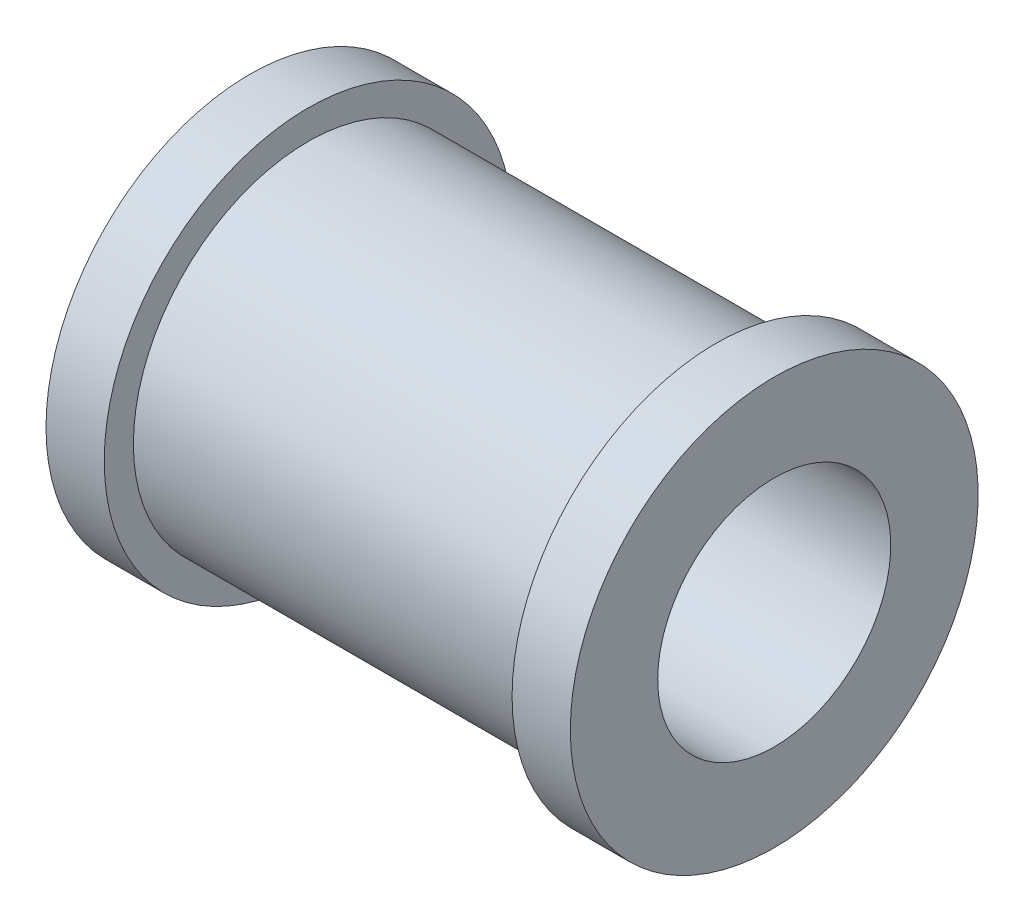
ISO-10303-21;
HEADER;
FILE_DESCRIPTION(('STEP AP214'),'2;1');
FILE_NAME('part.step','',(''),(''),'','','');
FILE_SCHEMA(('AUTOMOTIVE_DESIGN { 1 0 10303 214 1 1 1 1 }'));
ENDSEC;
DATA;
#1=APPLICATION_CONTEXT('core data for automotive mechanical design processes');
#2=APPLICATION_PROTOCOL_DEFINITION('international standard','automotive_design',2000,#1);
#3=PRODUCT_CONTEXT('',#1,'mechanical');
#4=PRODUCT('Part','Part','',(#3));
#5=PRODUCT_RELATED_PRODUCT_CATEGORY('part','',(#4));
#6=PRODUCT_DEFINITION_FORMATION('','',#4);
#7=PRODUCT_DEFINITION_CONTEXT('part definition',#1,'design');
#8=PRODUCT_DEFINITION('design','',#6,#7);
#9=PRODUCT_DEFINITION_SHAPE('','',#8);
#10=(LENGTH_UNIT() NAMED_UNIT(*) SI_UNIT(.MILLI.,.METRE.));
#11=(NAMED_UNIT(*) PLANE_ANGLE_UNIT() SI_UNIT($,.RADIAN.));
#12=(NAMED_UNIT(*) SI_UNIT($,.STERADIAN.) SOLID_ANGLE_UNIT());
#13=UNCERTAINTY_MEASURE_WITH_UNIT(LENGTH_MEASURE(1.E-05),#10,'distance_accuracy_value','');
#14=(GEOMETRIC_REPRESENTATION_CONTEXT(3) GLOBAL_UNCERTAINTY_ASSIGNED_CONTEXT((#13)) GLOBAL_UNIT_ASSIGNED_CONTEXT((#10,
#11,#12)) REPRESENTATION_CONTEXT('',''));
#15=CARTESIAN_POINT('',(0.,0.,0.));
#16=DIRECTION('',(0.,0.,1.));
#17=DIRECTION('',(1.,0.,0.));
#18=AXIS2_PLACEMENT_3D('',#15,#16,#17);
#19=CARTESIAN_POINT('',(0.,0.,0.));
#20=DIRECTION('',(-1.,0.,0.));
#21=DIRECTION('',(0.,0.,1.));
#22=AXIS2_PLACEMENT_3D('',#19,#20,#21);
#23=CYLINDRICAL_SURFACE('',#22,4.);
#24=CARTESIAN_POINT('',(18.,0.,0.));
#25=DIRECTION('',(-1.,0.,0.));
#26=DIRECTION('',(0.,0.,1.));
#27=AXIS2_PLACEMENT_3D('',#24,#25,#26);
#28=CIRCLE('',#27,4.);
#29=CARTESIAN_POINT('',(18.,0.,4.));
#30=VERTEX_POINT('',#29);
#31=EDGE_CURVE('E74',#30,#30,#28,.T.);
#32=ORIENTED_EDGE('',*,*,#31,.F.);
#33=EDGE_LOOP('',(#32));
#34=FACE_BOUND('',#33,.T.);
#35=CARTESIAN_POINT('',(0.,0.,0.));
#36=DIRECTION('',(-1.,0.,0.));
#37=DIRECTION('',(0.,0.,1.));
#38=AXIS2_PLACEMENT_3D('',#35,#36,#37);
#39=CIRCLE('',#38,4.);
#40=CARTESIAN_POINT('',(0.,0.,4.));
#41=VERTEX_POINT('',#40);
#42=EDGE_CURVE('E10',#41,#41,#39,.T.);
#43=ORIENTED_EDGE('',*,*,#42,.T.);
#44=EDGE_LOOP('',(#43));
#45=FACE_BOUND('',#44,.T.);
#46=ADVANCED_FACE('F39',(#34,#45),#23,.F.);
#47=CARTESIAN_POINT('',(0.,4.,0.));
#48=DIRECTION('',(1.,0.,0.));
#49=DIRECTION('',(0.,0.,-1.));
#50=AXIS2_PLACEMENT_3D('',#47,#48,#49);
#51=PLANE('',#50);
#52=ORIENTED_EDGE('',*,*,#42,.F.);
#53=EDGE_LOOP('',(#52));
#54=FACE_BOUND('',#53,.T.);
#55=CARTESIAN_POINT('',(0.,0.,0.));
#56=DIRECTION('',(-1.,0.,0.));
#57=DIRECTION('',(0.,0.,1.));
#58=AXIS2_PLACEMENT_3D('',#55,#56,#57);
#59=CIRCLE('',#58,7.);
#60=CARTESIAN_POINT('',(0.,0.,7.));
#61=VERTEX_POINT('',#60);
#62=EDGE_CURVE('E46',#61,#61,#59,.T.);
#63=ORIENTED_EDGE('',*,*,#62,.T.);
#64=EDGE_LOOP('',(#63));
#65=FACE_BOUND('',#64,.T.);
#66=ADVANCED_FACE('F82',(#54,#65),#51,.F.);
#67=CARTESIAN_POINT('',(0.,0.,0.));
#68=DIRECTION('',(-1.,0.,0.));
#69=DIRECTION('',(0.,0.,1.));
#70=AXIS2_PLACEMENT_3D('',#67,#68,#69);
#71=CYLINDRICAL_SURFACE('',#70,7.);
#72=ORIENTED_EDGE('',*,*,#62,.F.);
#73=EDGE_LOOP('',(#72));
#74=FACE_BOUND('',#73,.T.);
#75=CARTESIAN_POINT('',(2.,0.,0.));
#76=DIRECTION('',(-1.,0.,0.));
#77=DIRECTION('',(0.,0.,1.));
#78=AXIS2_PLACEMENT_3D('',#75,#76,#77);
#79=CIRCLE('',#78,7.);
#80=CARTESIAN_POINT('',(2.,0.,7.));
#81=VERTEX_POINT('',#80);
#82=EDGE_CURVE('E51',#81,#81,#79,.T.);
#83=ORIENTED_EDGE('',*,*,#82,.T.);
#84=EDGE_LOOP('',(#83));
#85=FACE_BOUND('',#84,.T.);
#86=ADVANCED_FACE('F86',(#74,#85),#71,.T.);
#87=CARTESIAN_POINT('',(2.,7.,0.));
#88=DIRECTION('',(-1.,0.,0.));
#89=DIRECTION('',(0.,0.,1.));
#90=AXIS2_PLACEMENT_3D('',#87,#88,#89);
#91=PLANE('',#90);
#92=ORIENTED_EDGE('',*,*,#82,.F.);
#93=EDGE_LOOP('',(#92));
#94=FACE_BOUND('',#93,.T.);
#95=CARTESIAN_POINT('',(2.,0.,0.));
#96=DIRECTION('',(-1.,0.,0.));
#97=DIRECTION('',(0.,0.,1.));
#98=AXIS2_PLACEMENT_3D('',#95,#96,#97);
#99=CIRCLE('',#98,6.);
#100=CARTESIAN_POINT('',(2.,0.,6.));
#101=VERTEX_POINT('',#100);
#102=EDGE_CURVE('E56',#101,#101,#99,.T.);
#103=ORIENTED_EDGE('',*,*,#102,.T.);
#104=EDGE_LOOP('',(#103));
#105=FACE_BOUND('',#104,.T.);
#106=ADVANCED_FACE('F91',(#94,#105),#91,.F.);
#107=CARTESIAN_POINT('',(0.,0.,0.));
#108=DIRECTION('',(-1.,0.,0.));
#109=DIRECTION('',(0.,0.,1.));
#110=AXIS2_PLACEMENT_3D('',#107,#108,#109);
#111=CYLINDRICAL_SURFACE('',#110,6.);
#112=ORIENTED_EDGE('',*,*,#102,.F.);
#113=EDGE_LOOP('',(#112));
#114=FACE_BOUND('',#113,.T.);
#115=CARTESIAN_POINT('',(16.,0.,0.));
#116=DIRECTION('',(-1.,0.,0.));
#117=DIRECTION('',(0.,0.,1.));
#118=AXIS2_PLACEMENT_3D('',#115,#116,#117);
#119=CIRCLE('',#118,6.);
#120=CARTESIAN_POINT('',(16.,0.,6.));
#121=VERTEX_POINT('',#120);
#122=EDGE_CURVE('E62',#121,#121,#119,.T.);
#123=ORIENTED_EDGE('',*,*,#122,.T.);
#124=EDGE_LOOP('',(#123));
#125=FACE_BOUND('',#124,.T.);
#126=ADVANCED_FACE('F97',(#114,#125),#111,.T.);
#127=CARTESIAN_POINT('',(16.,6.,0.));
#128=DIRECTION('',(1.,0.,0.));
#129=DIRECTION('',(0.,0.,-1.));
#130=AXIS2_PLACEMENT_3D('',#127,#128,#129);
#131=PLANE('',#130);
#132=ORIENTED_EDGE('',*,*,#122,.F.);
#133=EDGE_LOOP('',(#132));
#134=FACE_BOUND('',#133,.T.);
#135=CARTESIAN_POINT('',(16.,0.,0.));
#136=DIRECTION('',(-1.,0.,0.));
#137=DIRECTION('',(0.,0.,1.));
#138=AXIS2_PLACEMENT_3D('',#135,#136,#137);
#139=CIRCLE('',#138,7.);
#140=CARTESIAN_POINT('',(16.,0.,7.));
#141=VERTEX_POINT('',#140);
#142=EDGE_CURVE('E66',#141,#141,#139,.T.);
#143=ORIENTED_EDGE('',*,*,#142,.T.);
#144=EDGE_LOOP('',(#143));
#145=FACE_BOUND('',#144,.T.);
#146=ADVANCED_FACE('F101',(#134,#145),#131,.F.);
#147=CARTESIAN_POINT('',(0.,0.,0.));
#148=DIRECTION('',(-1.,0.,0.));
#149=DIRECTION('',(0.,0.,1.));
#150=AXIS2_PLACEMENT_3D('',#147,#148,#149);
#151=CYLINDRICAL_SURFACE('',#150,7.);
#152=ORIENTED_EDGE('',*,*,#142,.F.);
#153=EDGE_LOOP('',(#152));
#154=FACE_BOUND('',#153,.T.);
#155=CARTESIAN_POINT('',(18.,0.,0.));
#156=DIRECTION('',(-1.,0.,0.));
#157=DIRECTION('',(0.,0.,1.));
#158=AXIS2_PLACEMENT_3D('',#155,#156,#157);
#159=CIRCLE('',#158,7.);
#160=CARTESIAN_POINT('',(18.,0.,7.));
#161=VERTEX_POINT('',#160);
#162=EDGE_CURVE('E70',#161,#161,#159,.T.);
#163=ORIENTED_EDGE('',*,*,#162,.T.);
#164=EDGE_LOOP('',(#163));
#165=FACE_BOUND('',#164,.T.);
#166=ADVANCED_FACE('F105',(#154,#165),#151,.T.);
#167=CARTESIAN_POINT('',(18.,7.,0.));
#168=DIRECTION('',(-1.,0.,0.));
#169=DIRECTION('',(0.,0.,1.));
#170=AXIS2_PLACEMENT_3D('',#167,#168,#169);
#171=PLANE('',#170);
#172=ORIENTED_EDGE('',*,*,#162,.F.);
#173=EDGE_LOOP('',(#172));
#174=FACE_BOUND('',#173,.T.);
#175=ORIENTED_EDGE('',*,*,#31,.T.);
#176=EDGE_LOOP('',(#175));
#177=FACE_BOUND('',#176,.T.);
#178=ADVANCED_FACE('F79',(#174,#177),#171,.F.);
#179=CLOSED_SHELL('',(#46,#66,#86,#106,#126,#146,#166,#178));
#180=MANIFOLD_SOLID_BREP('B2',#179);
#181=ADVANCED_BREP_SHAPE_REPRESENTATION('',(#18,#180),#14);
#182=SHAPE_DEFINITION_REPRESENTATION(#9,#181);
ENDSEC;
END-ISO-10303-21;
